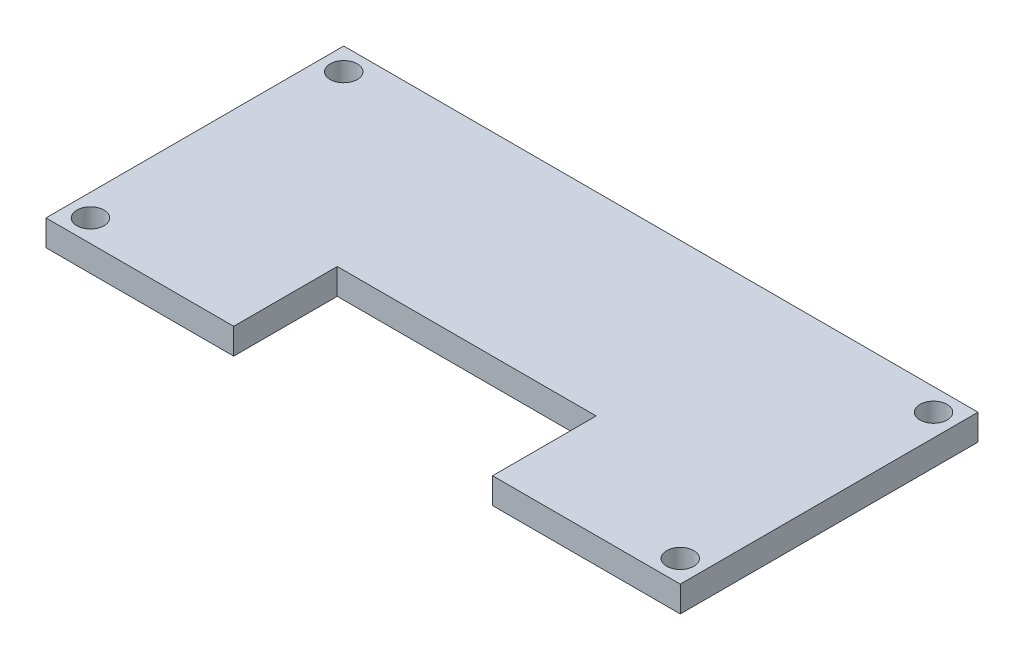
ISO-10303-21;
HEADER;
FILE_DESCRIPTION(('STEP AP214'),'2;1');
FILE_NAME('part.step','',(''),(''),'','','');
FILE_SCHEMA(('AUTOMOTIVE_DESIGN { 1 0 10303 214 1 1 1 1 }'));
ENDSEC;
DATA;
#1=APPLICATION_CONTEXT('core data for automotive mechanical design processes');
#2=APPLICATION_PROTOCOL_DEFINITION('international standard','automotive_design',2000,#1);
#3=PRODUCT_CONTEXT('',#1,'mechanical');
#4=PRODUCT('Part','Part','',(#3));
#5=PRODUCT_RELATED_PRODUCT_CATEGORY('part','',(#4));
#6=PRODUCT_DEFINITION_FORMATION('','',#4);
#7=PRODUCT_DEFINITION_CONTEXT('part definition',#1,'design');
#8=PRODUCT_DEFINITION('design','',#6,#7);
#9=PRODUCT_DEFINITION_SHAPE('','',#8);
#10=(LENGTH_UNIT() NAMED_UNIT(*) SI_UNIT(.MILLI.,.METRE.));
#11=(NAMED_UNIT(*) PLANE_ANGLE_UNIT() SI_UNIT($,.RADIAN.));
#12=(NAMED_UNIT(*) SI_UNIT($,.STERADIAN.) SOLID_ANGLE_UNIT());
#13=UNCERTAINTY_MEASURE_WITH_UNIT(LENGTH_MEASURE(1.E-05),#10,'distance_accuracy_value','');
#14=(GEOMETRIC_REPRESENTATION_CONTEXT(3) GLOBAL_UNCERTAINTY_ASSIGNED_CONTEXT((#13)) GLOBAL_UNIT_ASSIGNED_CONTEXT((#10,
#11,#12)) REPRESENTATION_CONTEXT('',''));
#15=CARTESIAN_POINT('',(0.,0.,0.));
#16=DIRECTION('',(0.,0.,1.));
#17=DIRECTION('',(1.,0.,0.));
#18=AXIS2_PLACEMENT_3D('',#15,#16,#17);
#19=CARTESIAN_POINT('',(0.,2.,0.));
#20=DIRECTION('',(0.,-1.,0.));
#21=DIRECTION('',(0.,0.,-1.));
#22=AXIS2_PLACEMENT_3D('',#19,#20,#21);
#23=PLANE('',#22);
#24=DIRECTION('',(0.,0.,-1.));
#25=VECTOR('',#24,1.);
#26=CARTESIAN_POINT('',(24.5,2.,11.5));
#27=LINE('',#26,#25);
#28=CARTESIAN_POINT('',(24.5,2.,11.5));
#29=VERTEX_POINT('',#28);
#30=CARTESIAN_POINT('',(24.5,2.,-11.5));
#31=VERTEX_POINT('',#30);
#32=EDGE_CURVE('E164',#29,#31,#27,.T.);
#33=ORIENTED_EDGE('',*,*,#32,.T.);
#34=DIRECTION('',(-1.,0.,0.));
#35=VECTOR('',#34,1.);
#36=CARTESIAN_POINT('',(-24.5,2.,-11.5));
#37=LINE('',#36,#35);
#38=CARTESIAN_POINT('',(-24.5,2.,-11.5));
#39=VERTEX_POINT('',#38);
#40=EDGE_CURVE('E100',#31,#39,#37,.T.);
#41=ORIENTED_EDGE('',*,*,#40,.T.);
#42=DIRECTION('',(0.,0.,1.));
#43=VECTOR('',#42,1.);
#44=CARTESIAN_POINT('',(-24.5,2.,11.5));
#45=LINE('',#44,#43);
#46=CARTESIAN_POINT('',(-24.5,2.,11.5));
#47=VERTEX_POINT('',#46);
#48=EDGE_CURVE('E185',#39,#47,#45,.T.);
#49=ORIENTED_EDGE('',*,*,#48,.T.);
#50=DIRECTION('',(1.,0.,0.));
#51=VECTOR('',#50,1.);
#52=CARTESIAN_POINT('',(-24.5,2.,11.5));
#53=LINE('',#52,#51);
#54=CARTESIAN_POINT('',(-10.,2.,11.5));
#55=VERTEX_POINT('',#54);
#56=EDGE_CURVE('E199',#47,#55,#53,.T.);
#57=ORIENTED_EDGE('',*,*,#56,.T.);
#58=DIRECTION('',(0.,0.,-1.));
#59=VECTOR('',#58,1.);
#60=CARTESIAN_POINT('',(-10.,2.,11.5));
#61=LINE('',#60,#59);
#62=CARTESIAN_POINT('',(-10.,2.,3.5));
#63=VERTEX_POINT('',#62);
#64=EDGE_CURVE('E119',#55,#63,#61,.T.);
#65=ORIENTED_EDGE('',*,*,#64,.T.);
#66=DIRECTION('',(1.,0.,0.));
#67=VECTOR('',#66,1.);
#68=CARTESIAN_POINT('',(-10.,2.,3.5));
#69=LINE('',#68,#67);
#70=CARTESIAN_POINT('',(10.,2.,3.5));
#71=VERTEX_POINT('',#70);
#72=EDGE_CURVE('E113',#63,#71,#69,.T.);
#73=ORIENTED_EDGE('',*,*,#72,.T.);
#74=DIRECTION('',(0.,0.,1.));
#75=VECTOR('',#74,1.);
#76=CARTESIAN_POINT('',(10.,2.,3.5));
#77=LINE('',#76,#75);
#78=CARTESIAN_POINT('',(10.,2.,11.5));
#79=VERTEX_POINT('',#78);
#80=EDGE_CURVE('E117',#71,#79,#77,.T.);
#81=ORIENTED_EDGE('',*,*,#80,.T.);
#82=DIRECTION('',(1.,0.,0.));
#83=VECTOR('',#82,1.);
#84=CARTESIAN_POINT('',(10.,2.,11.5));
#85=LINE('',#84,#83);
#86=EDGE_CURVE('E57',#79,#29,#85,.T.);
#87=ORIENTED_EDGE('',*,*,#86,.T.);
#88=EDGE_LOOP('',(#33,#41,#49,#57,#65,#73,#81,#87));
#89=FACE_BOUND('',#88,.T.);
#90=CARTESIAN_POINT('',(-22.7828427124746,2.,-9.78284271247462));
#91=DIRECTION('',(0.,1.,0.));
#92=DIRECTION('',(0.,0.,1.));
#93=AXIS2_PLACEMENT_3D('',#90,#91,#92);
#94=CIRCLE('',#93,1.05);
#95=CARTESIAN_POINT('',(-22.7828427124746,2.,-8.73284271247462));
#96=VERTEX_POINT('',#95);
#97=EDGE_CURVE('E146',#96,#96,#94,.T.);
#98=ORIENTED_EDGE('',*,*,#97,.F.);
#99=EDGE_LOOP('',(#98));
#100=FACE_BOUND('',#99,.T.);
#101=CARTESIAN_POINT('',(22.7828427124746,2.,-9.78284271247462));
#102=DIRECTION('',(0.,1.,0.));
#103=DIRECTION('',(0.,0.,-1.));
#104=AXIS2_PLACEMENT_3D('',#101,#102,#103);
#105=CIRCLE('',#104,1.05);
#106=CARTESIAN_POINT('',(22.7828427124746,2.,-10.8328427124746));
#107=VERTEX_POINT('',#106);
#108=EDGE_CURVE('E213',#107,#107,#105,.T.);
#109=ORIENTED_EDGE('',*,*,#108,.F.);
#110=EDGE_LOOP('',(#109));
#111=FACE_BOUND('',#110,.T.);
#112=CARTESIAN_POINT('',(22.7828427124746,2.,9.78284271247462));
#113=DIRECTION('',(0.,1.,0.));
#114=DIRECTION('',(0.,0.,1.));
#115=AXIS2_PLACEMENT_3D('',#112,#113,#114);
#116=CIRCLE('',#115,1.05);
#117=CARTESIAN_POINT('',(22.7828427124746,2.,10.8328427124746));
#118=VERTEX_POINT('',#117);
#119=EDGE_CURVE('E221',#118,#118,#116,.T.);
#120=ORIENTED_EDGE('',*,*,#119,.F.);
#121=EDGE_LOOP('',(#120));
#122=FACE_BOUND('',#121,.T.);
#123=CARTESIAN_POINT('',(-22.7828427124746,2.,9.78284271247462));
#124=DIRECTION('',(0.,1.,0.));
#125=DIRECTION('',(0.,0.,-1.));
#126=AXIS2_PLACEMENT_3D('',#123,#124,#125);
#127=CIRCLE('',#126,1.05);
#128=CARTESIAN_POINT('',(-22.7828427124746,2.,8.73284271247462));
#129=VERTEX_POINT('',#128);
#130=EDGE_CURVE('E229',#129,#129,#127,.T.);
#131=ORIENTED_EDGE('',*,*,#130,.F.);
#132=EDGE_LOOP('',(#131));
#133=FACE_BOUND('',#132,.T.);
#134=ADVANCED_FACE('F39',(#89,#100,#111,#122,#133),#23,.F.);
#135=CARTESIAN_POINT('',(0.,0.,0.));
#136=DIRECTION('',(0.,-1.,0.));
#137=DIRECTION('',(0.,0.,-1.));
#138=AXIS2_PLACEMENT_3D('',#135,#136,#137);
#139=PLANE('',#138);
#140=CARTESIAN_POINT('',(22.7828427124746,0.,9.78284271247462));
#141=DIRECTION('',(0.,1.,0.));
#142=DIRECTION('',(0.,0.,1.));
#143=AXIS2_PLACEMENT_3D('',#140,#141,#142);
#144=CIRCLE('',#143,1.05);
#145=CARTESIAN_POINT('',(22.7828427124746,0.,10.8328427124746));
#146=VERTEX_POINT('',#145);
#147=EDGE_CURVE('E225',#146,#146,#144,.T.);
#148=ORIENTED_EDGE('',*,*,#147,.T.);
#149=EDGE_LOOP('',(#148));
#150=FACE_BOUND('',#149,.T.);
#151=CARTESIAN_POINT('',(-22.7828427124746,0.,-9.78284271247462));
#152=DIRECTION('',(0.,1.,0.));
#153=DIRECTION('',(0.,0.,1.));
#154=AXIS2_PLACEMENT_3D('',#151,#152,#153);
#155=CIRCLE('',#154,1.05);
#156=CARTESIAN_POINT('',(-22.7828427124746,0.,-8.73284271247462));
#157=VERTEX_POINT('',#156);
#158=EDGE_CURVE('E209',#157,#157,#155,.T.);
#159=ORIENTED_EDGE('',*,*,#158,.T.);
#160=EDGE_LOOP('',(#159));
#161=FACE_BOUND('',#160,.T.);
#162=DIRECTION('',(0.,0.,-1.));
#163=VECTOR('',#162,1.);
#164=CARTESIAN_POINT('',(24.5,0.,11.5));
#165=LINE('',#164,#163);
#166=CARTESIAN_POINT('',(24.5,0.,11.5));
#167=VERTEX_POINT('',#166);
#168=CARTESIAN_POINT('',(24.5,0.,-11.5));
#169=VERTEX_POINT('',#168);
#170=EDGE_CURVE('E141',#167,#169,#165,.T.);
#171=ORIENTED_EDGE('',*,*,#170,.F.);
#172=DIRECTION('',(1.,0.,0.));
#173=VECTOR('',#172,1.);
#174=CARTESIAN_POINT('',(10.,0.,11.5));
#175=LINE('',#174,#173);
#176=CARTESIAN_POINT('',(10.,0.,11.5));
#177=VERTEX_POINT('',#176);
#178=EDGE_CURVE('E92',#177,#167,#175,.T.);
#179=ORIENTED_EDGE('',*,*,#178,.F.);
#180=DIRECTION('',(0.,0.,1.));
#181=VECTOR('',#180,1.);
#182=CARTESIAN_POINT('',(10.,0.,3.5));
#183=LINE('',#182,#181);
#184=CARTESIAN_POINT('',(10.,0.,3.5));
#185=VERTEX_POINT('',#184);
#186=EDGE_CURVE('E86',#185,#177,#183,.T.);
#187=ORIENTED_EDGE('',*,*,#186,.F.);
#188=DIRECTION('',(1.,0.,0.));
#189=VECTOR('',#188,1.);
#190=CARTESIAN_POINT('',(-10.,0.,3.5));
#191=LINE('',#190,#189);
#192=CARTESIAN_POINT('',(-10.,0.,3.5));
#193=VERTEX_POINT('',#192);
#194=EDGE_CURVE('E128',#193,#185,#191,.T.);
#195=ORIENTED_EDGE('',*,*,#194,.F.);
#196=DIRECTION('',(0.,0.,-1.));
#197=VECTOR('',#196,1.);
#198=CARTESIAN_POINT('',(-10.,0.,11.5));
#199=LINE('',#198,#197);
#200=CARTESIAN_POINT('',(-10.,0.,11.5));
#201=VERTEX_POINT('',#200);
#202=EDGE_CURVE('E155',#201,#193,#199,.T.);
#203=ORIENTED_EDGE('',*,*,#202,.F.);
#204=DIRECTION('',(1.,0.,0.));
#205=VECTOR('',#204,1.);
#206=CARTESIAN_POINT('',(-24.5,0.,11.5));
#207=LINE('',#206,#205);
#208=CARTESIAN_POINT('',(-24.5,0.,11.5));
#209=VERTEX_POINT('',#208);
#210=EDGE_CURVE('E152',#209,#201,#207,.T.);
#211=ORIENTED_EDGE('',*,*,#210,.F.);
#212=DIRECTION('',(0.,0.,1.));
#213=VECTOR('',#212,1.);
#214=CARTESIAN_POINT('',(-24.5,0.,11.5));
#215=LINE('',#214,#213);
#216=CARTESIAN_POINT('',(-24.5,0.,-11.5));
#217=VERTEX_POINT('',#216);
#218=EDGE_CURVE('E149',#217,#209,#215,.T.);
#219=ORIENTED_EDGE('',*,*,#218,.F.);
#220=DIRECTION('',(-1.,0.,0.));
#221=VECTOR('',#220,1.);
#222=CARTESIAN_POINT('',(-24.5,0.,-11.5));
#223=LINE('',#222,#221);
#224=EDGE_CURVE('E145',#169,#217,#223,.T.);
#225=ORIENTED_EDGE('',*,*,#224,.F.);
#226=EDGE_LOOP('',(#171,#179,#187,#195,#203,#211,#219,#225));
#227=FACE_BOUND('',#226,.T.);
#228=CARTESIAN_POINT('',(22.7828427124746,0.,-9.78284271247462));
#229=DIRECTION('',(0.,1.,0.));
#230=DIRECTION('',(0.,0.,-1.));
#231=AXIS2_PLACEMENT_3D('',#228,#229,#230);
#232=CIRCLE('',#231,1.05);
#233=CARTESIAN_POINT('',(22.7828427124746,0.,-10.8328427124746));
#234=VERTEX_POINT('',#233);
#235=EDGE_CURVE('E217',#234,#234,#232,.T.);
#236=ORIENTED_EDGE('',*,*,#235,.T.);
#237=EDGE_LOOP('',(#236));
#238=FACE_BOUND('',#237,.T.);
#239=CARTESIAN_POINT('',(-22.7828427124746,0.,9.78284271247462));
#240=DIRECTION('',(0.,1.,0.));
#241=DIRECTION('',(0.,0.,-1.));
#242=AXIS2_PLACEMENT_3D('',#239,#240,#241);
#243=CIRCLE('',#242,1.05);
#244=CARTESIAN_POINT('',(-22.7828427124746,0.,8.73284271247462));
#245=VERTEX_POINT('',#244);
#246=EDGE_CURVE('E233',#245,#245,#243,.T.);
#247=ORIENTED_EDGE('',*,*,#246,.T.);
#248=EDGE_LOOP('',(#247));
#249=FACE_BOUND('',#248,.T.);
#250=ADVANCED_FACE('F189',(#150,#161,#227,#238,#249),#139,.T.);
#251=CARTESIAN_POINT('',(24.5,2.,11.5));
#252=DIRECTION('',(-1.,0.,0.));
#253=DIRECTION('',(0.,0.,1.));
#254=AXIS2_PLACEMENT_3D('',#251,#252,#253);
#255=PLANE('',#254);
#256=ORIENTED_EDGE('',*,*,#170,.T.);
#257=DIRECTION('',(0.,-1.,0.));
#258=VECTOR('',#257,1.);
#259=CARTESIAN_POINT('',(24.5,2.,-11.5));
#260=LINE('',#259,#258);
#261=EDGE_CURVE('E11',#31,#169,#260,.T.);
#262=ORIENTED_EDGE('',*,*,#261,.F.);
#263=ORIENTED_EDGE('',*,*,#32,.F.);
#264=DIRECTION('',(0.,-1.,0.));
#265=VECTOR('',#264,1.);
#266=CARTESIAN_POINT('',(24.5,2.,11.5));
#267=LINE('',#266,#265);
#268=EDGE_CURVE('E137',#29,#167,#267,.T.);
#269=ORIENTED_EDGE('',*,*,#268,.T.);
#270=EDGE_LOOP('',(#256,#262,#263,#269));
#271=FACE_BOUND('',#270,.T.);
#272=ADVANCED_FACE('F41',(#271),#255,.F.);
#273=CARTESIAN_POINT('',(-24.5,2.,-11.5));
#274=DIRECTION('',(0.,0.,1.));
#275=DIRECTION('',(1.,0.,0.));
#276=AXIS2_PLACEMENT_3D('',#273,#274,#275);
#277=PLANE('',#276);
#278=ORIENTED_EDGE('',*,*,#224,.T.);
#279=DIRECTION('',(0.,-1.,0.));
#280=VECTOR('',#279,1.);
#281=CARTESIAN_POINT('',(-24.5,2.,-11.5));
#282=LINE('',#281,#280);
#283=EDGE_CURVE('E49',#39,#217,#282,.T.);
#284=ORIENTED_EDGE('',*,*,#283,.F.);
#285=ORIENTED_EDGE('',*,*,#40,.F.);
#286=ORIENTED_EDGE('',*,*,#261,.T.);
#287=EDGE_LOOP('',(#278,#284,#285,#286));
#288=FACE_BOUND('',#287,.T.);
#289=ADVANCED_FACE('F267',(#288),#277,.F.);
#290=CARTESIAN_POINT('',(-24.5,2.,11.5));
#291=DIRECTION('',(1.,0.,0.));
#292=DIRECTION('',(0.,0.,-1.));
#293=AXIS2_PLACEMENT_3D('',#290,#291,#292);
#294=PLANE('',#293);
#295=ORIENTED_EDGE('',*,*,#218,.T.);
#296=DIRECTION('',(0.,-1.,0.));
#297=VECTOR('',#296,1.);
#298=CARTESIAN_POINT('',(-24.5,2.,11.5));
#299=LINE('',#298,#297);
#300=EDGE_CURVE('E175',#47,#209,#299,.T.);
#301=ORIENTED_EDGE('',*,*,#300,.F.);
#302=ORIENTED_EDGE('',*,*,#48,.F.);
#303=ORIENTED_EDGE('',*,*,#283,.T.);
#304=EDGE_LOOP('',(#295,#301,#302,#303));
#305=FACE_BOUND('',#304,.T.);
#306=ADVANCED_FACE('F183',(#305),#294,.F.);
#307=CARTESIAN_POINT('',(-24.5,2.,11.5));
#308=DIRECTION('',(0.,0.,-1.));
#309=DIRECTION('',(-1.,0.,0.));
#310=AXIS2_PLACEMENT_3D('',#307,#308,#309);
#311=PLANE('',#310);
#312=ORIENTED_EDGE('',*,*,#210,.T.);
#313=DIRECTION('',(0.,-1.,0.));
#314=VECTOR('',#313,1.);
#315=CARTESIAN_POINT('',(-10.,2.,11.5));
#316=LINE('',#315,#314);
#317=EDGE_CURVE('E171',#55,#201,#316,.T.);
#318=ORIENTED_EDGE('',*,*,#317,.F.);
#319=ORIENTED_EDGE('',*,*,#56,.F.);
#320=ORIENTED_EDGE('',*,*,#300,.T.);
#321=EDGE_LOOP('',(#312,#318,#319,#320));
#322=FACE_BOUND('',#321,.T.);
#323=ADVANCED_FACE('F194',(#322),#311,.F.);
#324=CARTESIAN_POINT('',(-10.,2.,11.5));
#325=DIRECTION('',(-1.,0.,0.));
#326=DIRECTION('',(0.,0.,1.));
#327=AXIS2_PLACEMENT_3D('',#324,#325,#326);
#328=PLANE('',#327);
#329=ORIENTED_EDGE('',*,*,#202,.T.);
#330=DIRECTION('',(0.,-1.,0.));
#331=VECTOR('',#330,1.);
#332=CARTESIAN_POINT('',(-10.,2.,3.5));
#333=LINE('',#332,#331);
#334=EDGE_CURVE('E130',#63,#193,#333,.T.);
#335=ORIENTED_EDGE('',*,*,#334,.F.);
#336=ORIENTED_EDGE('',*,*,#64,.F.);
#337=ORIENTED_EDGE('',*,*,#317,.T.);
#338=EDGE_LOOP('',(#329,#335,#336,#337));
#339=FACE_BOUND('',#338,.T.);
#340=ADVANCED_FACE('F197',(#339),#328,.F.);
#341=CARTESIAN_POINT('',(-10.,2.,3.5));
#342=DIRECTION('',(0.,0.,-1.));
#343=DIRECTION('',(-1.,0.,0.));
#344=AXIS2_PLACEMENT_3D('',#341,#342,#343);
#345=PLANE('',#344);
#346=ORIENTED_EDGE('',*,*,#194,.T.);
#347=DIRECTION('',(0.,-1.,0.));
#348=VECTOR('',#347,1.);
#349=CARTESIAN_POINT('',(10.,2.,3.5));
#350=LINE('',#349,#348);
#351=EDGE_CURVE('E125',#71,#185,#350,.T.);
#352=ORIENTED_EDGE('',*,*,#351,.F.);
#353=ORIENTED_EDGE('',*,*,#72,.F.);
#354=ORIENTED_EDGE('',*,*,#334,.T.);
#355=EDGE_LOOP('',(#346,#352,#353,#354));
#356=FACE_BOUND('',#355,.T.);
#357=ADVANCED_FACE('F126',(#356),#345,.F.);
#358=CARTESIAN_POINT('',(10.,2.,3.5));
#359=DIRECTION('',(1.,0.,0.));
#360=DIRECTION('',(0.,0.,-1.));
#361=AXIS2_PLACEMENT_3D('',#358,#359,#360);
#362=PLANE('',#361);
#363=ORIENTED_EDGE('',*,*,#186,.T.);
#364=DIRECTION('',(0.,-1.,0.));
#365=VECTOR('',#364,1.);
#366=CARTESIAN_POINT('',(10.,2.,11.5));
#367=LINE('',#366,#365);
#368=EDGE_CURVE('E131',#79,#177,#367,.T.);
#369=ORIENTED_EDGE('',*,*,#368,.F.);
#370=ORIENTED_EDGE('',*,*,#80,.F.);
#371=ORIENTED_EDGE('',*,*,#351,.T.);
#372=EDGE_LOOP('',(#363,#369,#370,#371));
#373=FACE_BOUND('',#372,.T.);
#374=ADVANCED_FACE('F133',(#373),#362,.F.);
#375=CARTESIAN_POINT('',(10.,2.,11.5));
#376=DIRECTION('',(0.,0.,-1.));
#377=DIRECTION('',(-1.,0.,0.));
#378=AXIS2_PLACEMENT_3D('',#375,#376,#377);
#379=PLANE('',#378);
#380=ORIENTED_EDGE('',*,*,#178,.T.);
#381=ORIENTED_EDGE('',*,*,#268,.F.);
#382=ORIENTED_EDGE('',*,*,#86,.F.);
#383=ORIENTED_EDGE('',*,*,#368,.T.);
#384=EDGE_LOOP('',(#380,#381,#382,#383));
#385=FACE_BOUND('',#384,.T.);
#386=ADVANCED_FACE('F255',(#385),#379,.F.);
#387=CARTESIAN_POINT('',(-22.7828427124746,2.,-9.78284271247462));
#388=DIRECTION('',(0.,-1.,0.));
#389=DIRECTION('',(0.,0.,-1.));
#390=AXIS2_PLACEMENT_3D('',#387,#388,#389);
#391=CYLINDRICAL_SURFACE('',#390,1.05);
#392=ORIENTED_EDGE('',*,*,#97,.T.);
#393=EDGE_LOOP('',(#392));
#394=FACE_BOUND('',#393,.T.);
#395=ORIENTED_EDGE('',*,*,#158,.F.);
#396=EDGE_LOOP('',(#395));
#397=FACE_BOUND('',#396,.T.);
#398=ADVANCED_FACE('F252',(#394,#397),#391,.F.);
#399=CARTESIAN_POINT('',(22.7828427124746,2.,-9.78284271247462));
#400=DIRECTION('',(0.,-1.,0.));
#401=DIRECTION('',(0.,0.,-1.));
#402=AXIS2_PLACEMENT_3D('',#399,#400,#401);
#403=CYLINDRICAL_SURFACE('',#402,1.05);
#404=ORIENTED_EDGE('',*,*,#108,.T.);
#405=EDGE_LOOP('',(#404));
#406=FACE_BOUND('',#405,.T.);
#407=ORIENTED_EDGE('',*,*,#235,.F.);
#408=EDGE_LOOP('',(#407));
#409=FACE_BOUND('',#408,.T.);
#410=ADVANCED_FACE('F331',(#406,#409),#403,.F.);
#411=CARTESIAN_POINT('',(22.7828427124746,2.,9.78284271247462));
#412=DIRECTION('',(0.,-1.,0.));
#413=DIRECTION('',(0.,0.,-1.));
#414=AXIS2_PLACEMENT_3D('',#411,#412,#413);
#415=CYLINDRICAL_SURFACE('',#414,1.05);
#416=ORIENTED_EDGE('',*,*,#119,.T.);
#417=EDGE_LOOP('',(#416));
#418=FACE_BOUND('',#417,.T.);
#419=ORIENTED_EDGE('',*,*,#147,.F.);
#420=EDGE_LOOP('',(#419));
#421=FACE_BOUND('',#420,.T.);
#422=ADVANCED_FACE('F339',(#418,#421),#415,.F.);
#423=CARTESIAN_POINT('',(-22.7828427124746,2.,9.78284271247462));
#424=DIRECTION('',(0.,-1.,0.));
#425=DIRECTION('',(0.,0.,-1.));
#426=AXIS2_PLACEMENT_3D('',#423,#424,#425);
#427=CYLINDRICAL_SURFACE('',#426,1.05);
#428=ORIENTED_EDGE('',*,*,#130,.T.);
#429=EDGE_LOOP('',(#428));
#430=FACE_BOUND('',#429,.T.);
#431=ORIENTED_EDGE('',*,*,#246,.F.);
#432=EDGE_LOOP('',(#431));
#433=FACE_BOUND('',#432,.T.);
#434=ADVANCED_FACE('F241',(#430,#433),#427,.F.);
#435=CLOSED_SHELL('',(#134,#250,#272,#289,#306,#323,#340,#357,#374,#386,#398,#410,#422,#434));
#436=MANIFOLD_SOLID_BREP('B2',#435);
#437=ADVANCED_BREP_SHAPE_REPRESENTATION('',(#18,#436),#14);
#438=SHAPE_DEFINITION_REPRESENTATION(#9,#437);
ENDSEC;
END-ISO-10303-21;
